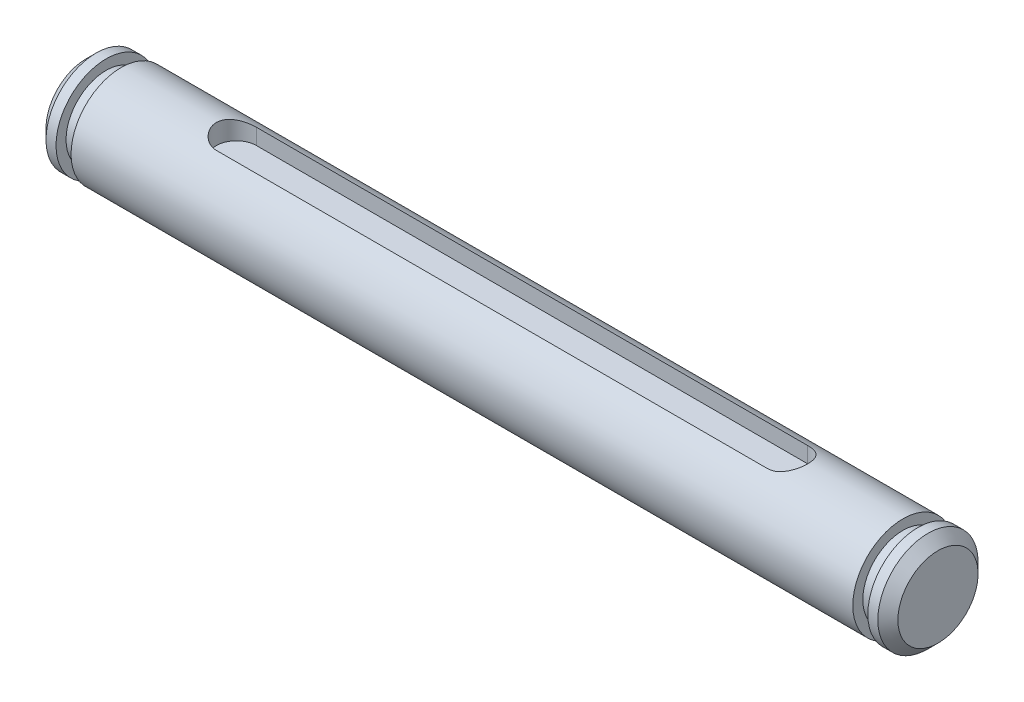
ISO-10303-21;
HEADER;
FILE_DESCRIPTION(('STEP AP214'),'2;1');
FILE_NAME('part.step','',(''),(''),'','','');
FILE_SCHEMA(('AUTOMOTIVE_DESIGN { 1 0 10303 214 1 1 1 1 }'));
ENDSEC;
DATA;
#1=APPLICATION_CONTEXT('core data for automotive mechanical design processes');
#2=APPLICATION_PROTOCOL_DEFINITION('international standard','automotive_design',2000,#1);
#3=PRODUCT_CONTEXT('',#1,'mechanical');
#4=PRODUCT('Part','Part','',(#3));
#5=PRODUCT_RELATED_PRODUCT_CATEGORY('part','',(#4));
#6=PRODUCT_DEFINITION_FORMATION('','',#4);
#7=PRODUCT_DEFINITION_CONTEXT('part definition',#1,'design');
#8=PRODUCT_DEFINITION('design','',#6,#7);
#9=PRODUCT_DEFINITION_SHAPE('','',#8);
#10=(LENGTH_UNIT() NAMED_UNIT(*) SI_UNIT(.MILLI.,.METRE.));
#11=(NAMED_UNIT(*) PLANE_ANGLE_UNIT() SI_UNIT($,.RADIAN.));
#12=(NAMED_UNIT(*) SI_UNIT($,.STERADIAN.) SOLID_ANGLE_UNIT());
#13=UNCERTAINTY_MEASURE_WITH_UNIT(LENGTH_MEASURE(1.E-05),#10,'distance_accuracy_value','');
#14=(GEOMETRIC_REPRESENTATION_CONTEXT(3) GLOBAL_UNCERTAINTY_ASSIGNED_CONTEXT((#13)) GLOBAL_UNIT_ASSIGNED_CONTEXT((#10,
#11,#12)) REPRESENTATION_CONTEXT('',''));
#15=CARTESIAN_POINT('',(0.,0.,0.));
#16=DIRECTION('',(0.,0.,1.));
#17=DIRECTION('',(1.,0.,0.));
#18=AXIS2_PLACEMENT_3D('',#15,#16,#17);
#19=CARTESIAN_POINT('',(-47.1519917646546,0.,0.));
#20=DIRECTION('',(-1.,0.,0.));
#21=DIRECTION('',(0.,0.,1.));
#22=AXIS2_PLACEMENT_3D('',#19,#20,#21);
#23=CYLINDRICAL_SURFACE('',#22,5.);
#24=CARTESIAN_POINT('',(39.,0.,0.));
#25=DIRECTION('',(-1.,0.,0.));
#26=DIRECTION('',(0.,0.,1.));
#27=AXIS2_PLACEMENT_3D('',#24,#25,#26);
#28=CIRCLE('',#27,5.00000000000001);
#29=CARTESIAN_POINT('',(39.,0.,5.00000000000001));
#30=VERTEX_POINT('',#29);
#31=EDGE_CURVE('E128',#30,#30,#28,.T.);
#32=ORIENTED_EDGE('',*,*,#31,.T.);
#33=EDGE_LOOP('',(#32));
#34=FACE_BOUND('',#33,.T.);
#35=CARTESIAN_POINT('',(-39.,0.,0.));
#36=DIRECTION('',(-1.,0.,0.));
#37=DIRECTION('',(0.,0.,1.));
#38=AXIS2_PLACEMENT_3D('',#35,#36,#37);
#39=CIRCLE('',#38,5.);
#40=CARTESIAN_POINT('',(-39.,0.,5.));
#41=VERTEX_POINT('',#40);
#42=EDGE_CURVE('E125',#41,#41,#39,.T.);
#43=ORIENTED_EDGE('',*,*,#42,.F.);
#44=EDGE_LOOP('',(#43));
#45=FACE_BOUND('',#44,.T.);
#46=CARTESIAN_POINT('',(-27.5,4.58257569495585,-2.));
#47=CARTESIAN_POINT('',(-27.5538058525026,4.58256464470382,-2.00000798036347));
#48=CARTESIAN_POINT('',(-27.6076056655576,4.58352306077323,-1.99782891366025));
#49=CARTESIAN_POINT('',(-27.7147712982547,4.58729625417544,-1.98915905973446));
#50=CARTESIAN_POINT('',(-27.768137275356,4.59011032448546,-1.98266991468792));
#51=CARTESIAN_POINT('',(-27.8738468215588,4.5974978292064,-1.9654760367637));
#52=CARTESIAN_POINT('',(-27.926193584044,4.60206430717533,-1.95478796820434));
#53=CARTESIAN_POINT('',(-28.0297007717145,4.61280053296683,-1.9293163019066));
#54=CARTESIAN_POINT('',(-28.0808611242772,4.61897037865399,-1.9145324541709));
#55=CARTESIAN_POINT('',(-28.231935850582,4.63959291248422,-1.86426971793523));
#56=CARTESIAN_POINT('',(-28.3296542306898,4.65617449157431,-1.82284489460008));
#57=CARTESIAN_POINT('',(-28.5167955800826,4.6931237076538,-1.72548191592176));
#58=CARTESIAN_POINT('',(-28.6062105529617,4.71349493864007,-1.66952996336925));
#59=CARTESIAN_POINT('',(-28.7792623966742,4.75700999402115,-1.54131835736855));
#60=CARTESIAN_POINT('',(-28.8623672169202,4.78024245635517,-1.4683691399273));
#61=CARTESIAN_POINT('',(-29.0155402722107,4.82612790548656,-1.30969646176209));
#62=CARTESIAN_POINT('',(-29.0856058308657,4.84878077249721,-1.22397038499682));
#63=CARTESIAN_POINT('',(-29.2134063941956,4.89203417106083,-1.03800590808969));
#64=CARTESIAN_POINT('',(-29.2705448092619,4.91251824543531,-0.937327933050964));
#65=CARTESIAN_POINT('',(-29.3668440726887,4.94803944125004,-0.726824143246711));
#66=CARTESIAN_POINT('',(-29.4060124240517,4.96307883544185,-0.617002169026244));
#67=CARTESIAN_POINT('',(-29.4633412013106,4.98538314653816,-0.396967441295689));
#68=CARTESIAN_POINT('',(-29.4824269509057,4.99298922547927,-0.287031054523057));
#69=CARTESIAN_POINT('',(-29.5020284799456,5.00080310201086,-0.0652684304565121));
#70=CARTESIAN_POINT('',(-29.5025508380235,5.0010135205303,0.0465571232841689));
#71=CARTESIAN_POINT('',(-29.4855171608401,4.99421960045303,0.262233376226788));
#72=CARTESIAN_POINT('',(-29.468974953326,4.98761985585461,0.366179202506795));
#73=CARTESIAN_POINT('',(-29.4200065729465,4.96849270441446,0.569674786500934));
#74=CARTESIAN_POINT('',(-29.3875795011314,4.9559649620993,0.669224295072847));
#75=CARTESIAN_POINT('',(-29.3073637035755,4.92596830598785,0.862897539070301));
#76=CARTESIAN_POINT('',(-29.2593507591896,4.90842774755848,0.956916851366445));
#77=CARTESIAN_POINT('',(-29.1495354114049,4.87014602008043,1.13580746919777));
#78=CARTESIAN_POINT('',(-29.0877281703094,4.84940372896449,1.22067554984698));
#79=CARTESIAN_POINT('',(-28.9473558197415,4.80521782746144,1.38476339273628));
#80=CARTESIAN_POINT('',(-28.86795752533,4.78168627172885,1.4632477030894));
#81=CARTESIAN_POINT('',(-28.6970199048523,4.7356195058465,1.60609926099479));
#82=CARTESIAN_POINT('',(-28.6054750779057,4.71308475332783,1.67046007709006));
#83=CARTESIAN_POINT('',(-28.4095297159788,4.67095688856025,1.78493657933606));
#84=CARTESIAN_POINT('',(-28.3048351633398,4.65146702150583,1.83458932217623));
#85=CARTESIAN_POINT('',(-28.0876384755705,4.61886105059582,1.91521298357265));
#86=CARTESIAN_POINT('',(-27.9751505526617,4.60573367628738,1.94621696002209));
#87=CARTESIAN_POINT('',(-27.801256365842,4.59208303529493,1.97810581825721));
#88=CARTESIAN_POINT('',(-27.7413424506987,4.58853437680526,1.9863050516598));
#89=CARTESIAN_POINT('',(-27.6209649810045,4.58377540314388,1.99725282103813));
#90=CARTESIAN_POINT('',(-27.5605017882422,4.58256364711744,2.00000471568569));
#91=CARTESIAN_POINT('',(-27.5,4.58257569495584,2.00000000000001));
#92=B_SPLINE_CURVE_WITH_KNOTS('',3,(#46,#47,#48,#49,#50,#51,#52,#53,#54,#55,#56,#57,#58,#59,#60,
#61,#62,#63,#64,#65,#66,#67,#68,#69,#70,#71,#72,#73,#74,#75,#76,#77,#78,#79,#80,#81,#82,#83,#84,
#85,#86,#87,#88,#89,#90,#91),.UNSPECIFIED.,.F.,.F.,(4,2,2,2,2,2,2,2,2,2,2,2,2,2,2,2,2,2,2,2,2,2,
4),(0.,0.161354853098824,0.322648263883212,0.483307911251883,0.643977367092306,
0.964683001739097,1.28569434942626,1.62318047995498,1.96073580539191,2.31162858925764,
2.66237473197323,2.9961387650427,3.32978451514656,3.64468915259536,3.95961161305655,
4.27928176927548,4.5990642113302,4.93981874675154,5.28072813203935,5.63144241548464,
5.98153315592126,6.16300192557815,6.34435877193562),.UNSPECIFIED.);
#93=CARTESIAN_POINT('',(-27.5,4.58257569495585,-2.));
#94=VERTEX_POINT('',#93);
#95=CARTESIAN_POINT('',(-27.5,4.58257569495585,2.00000000000001));
#96=VERTEX_POINT('',#95);
#97=EDGE_CURVE('E11',#94,#96,#92,.T.);
#98=ORIENTED_EDGE('',*,*,#97,.F.);
#99=DIRECTION('',(-1.,0.,0.));
#100=VECTOR('',#99,1.);
#101=CARTESIAN_POINT('',(-47.1519917646546,4.58257569495585,-2.));
#102=LINE('',#101,#100);
#103=CARTESIAN_POINT('',(27.5,4.58257569495584,-2.00000000000001));
#104=VERTEX_POINT('',#103);
#105=EDGE_CURVE('E61',#94,#104,#102,.F.);
#106=ORIENTED_EDGE('',*,*,#105,.T.);
#107=CARTESIAN_POINT('',(27.5,4.58257569495584,2.00000000000001));
#108=CARTESIAN_POINT('',(27.5538058525026,4.58256464470381,2.00000798036349));
#109=CARTESIAN_POINT('',(27.6076056655576,4.58352306077323,1.99782891366026));
#110=CARTESIAN_POINT('',(27.7147712982547,4.58729625417543,1.98915905973448));
#111=CARTESIAN_POINT('',(27.768137275356,4.59011032448545,1.98266991468794));
#112=CARTESIAN_POINT('',(27.8738468215588,4.59749782920639,1.96547603676371));
#113=CARTESIAN_POINT('',(27.926193584044,4.60206430717533,1.95478796820435));
#114=CARTESIAN_POINT('',(28.0297007717145,4.61280053296682,1.92931630190662));
#115=CARTESIAN_POINT('',(28.0808611242772,4.61897037865398,1.91453245417092));
#116=CARTESIAN_POINT('',(28.231935850582,4.63959291248421,1.86426971793524));
#117=CARTESIAN_POINT('',(28.3296542306898,4.6561744915743,1.82284489460009));
#118=CARTESIAN_POINT('',(28.5167955800826,4.6931237076538,1.72548191592177));
#119=CARTESIAN_POINT('',(28.6062105529617,4.71349493864007,1.66952996336927));
#120=CARTESIAN_POINT('',(28.7792623966742,4.75700999402114,1.54131835736856));
#121=CARTESIAN_POINT('',(28.8623672169202,4.78024245635516,1.46836913992731));
#122=CARTESIAN_POINT('',(29.0155402722107,4.82612790548656,1.3096964617621));
#123=CARTESIAN_POINT('',(29.0856058308657,4.84878077249721,1.22397038499683));
#124=CARTESIAN_POINT('',(29.2134063941957,4.89203417106082,1.0380059080897));
#125=CARTESIAN_POINT('',(29.2705448092619,4.91251824543531,0.937327933050974));
#126=CARTESIAN_POINT('',(29.3668440726887,4.94803944125004,0.72682414324672));
#127=CARTESIAN_POINT('',(29.4060124240517,4.96307883544185,0.617002169026255));
#128=CARTESIAN_POINT('',(29.4633412013106,4.98538314653816,0.396967441295701));
#129=CARTESIAN_POINT('',(29.4824269509057,4.99298922547927,0.287031054523069));
#130=CARTESIAN_POINT('',(29.5020284799456,5.00080310201086,0.0652684304565236));
#131=CARTESIAN_POINT('',(29.5025508380235,5.0010135205303,-0.0465571232841574));
#132=CARTESIAN_POINT('',(29.4855171608401,4.99421960045303,-0.262233376226777));
#133=CARTESIAN_POINT('',(29.468974953326,4.98761985585461,-0.366179202506784));
#134=CARTESIAN_POINT('',(29.4200065729465,4.96849270441447,-0.569674786500923));
#135=CARTESIAN_POINT('',(29.3875795011314,4.9559649620993,-0.669224295072836));
#136=CARTESIAN_POINT('',(29.3073637035755,4.92596830598786,-0.86289753907029));
#137=CARTESIAN_POINT('',(29.2593507591896,4.90842774755848,-0.956916851366434));
#138=CARTESIAN_POINT('',(29.1495354114049,4.87014602008044,-1.13580746919776));
#139=CARTESIAN_POINT('',(29.0877281703094,4.84940372896449,-1.22067554984697));
#140=CARTESIAN_POINT('',(28.9473558197415,4.80521782746144,-1.38476339273626));
#141=CARTESIAN_POINT('',(28.86795752533,4.78168627172885,-1.46324770308939));
#142=CARTESIAN_POINT('',(28.6970199048523,4.7356195058465,-1.60609926099477));
#143=CARTESIAN_POINT('',(28.6054750779057,4.71308475332783,-1.67046007709005));
#144=CARTESIAN_POINT('',(28.4095297159788,4.67095688856025,-1.78493657933605));
#145=CARTESIAN_POINT('',(28.3048351633398,4.65146702150584,-1.83458932217622));
#146=CARTESIAN_POINT('',(28.0876384755705,4.61886105059582,-1.91521298357264));
#147=CARTESIAN_POINT('',(27.9751505526617,4.60573367628738,-1.94621696002208));
#148=CARTESIAN_POINT('',(27.801256365842,4.59208303529493,-1.9781058182572));
#149=CARTESIAN_POINT('',(27.7413424506987,4.58853437680527,-1.98630505165979));
#150=CARTESIAN_POINT('',(27.6209649810045,4.58377540314389,-1.99725282103812));
#151=CARTESIAN_POINT('',(27.5605017882422,4.58256364711745,-2.00000471568568));
#152=CARTESIAN_POINT('',(27.5,4.58257569495585,-2.));
#153=B_SPLINE_CURVE_WITH_KNOTS('',3,(#107,#108,#109,#110,#111,#112,#113,#114,#115,#116,#117,
#118,#119,#120,#121,#122,#123,#124,#125,#126,#127,#128,#129,#130,#131,#132,#133,#134,#135,#136,
#137,#138,#139,#140,#141,#142,#143,#144,#145,#146,#147,#148,#149,#150,#151,#152),.UNSPECIFIED.,
.F.,.F.,(4,2,2,2,2,2,2,2,2,2,2,2,2,2,2,2,2,2,2,2,2,2,4),(0.,0.161354853098825,0.322648263883212,
0.483307911251883,0.643977367092306,0.964683001739097,1.28569434942626,1.62318047995498,
1.96073580539191,2.31162858925764,2.66237473197323,2.99613876504271,3.32978451514656,
3.64468915259536,3.95961161305655,4.27928176927548,4.5990642113302,4.93981874675154,
5.28072813203935,5.63144241548464,5.98153315592126,6.16300192557815,6.34435877193563),.UNSPECIFIED.);
#154=CARTESIAN_POINT('',(27.5,4.58257569495585,2.00000000000001));
#155=VERTEX_POINT('',#154);
#156=EDGE_CURVE('E54',#155,#104,#153,.T.);
#157=ORIENTED_EDGE('',*,*,#156,.F.);
#158=DIRECTION('',(-1.,0.,0.));
#159=VECTOR('',#158,1.);
#160=CARTESIAN_POINT('',(-47.1519917646546,4.58257569495584,2.));
#161=LINE('',#160,#159);
#162=EDGE_CURVE('E152',#155,#96,#161,.T.);
#163=ORIENTED_EDGE('',*,*,#162,.T.);
#164=EDGE_LOOP('',(#98,#106,#157,#163));
#165=FACE_BOUND('',#164,.T.);
#166=ADVANCED_FACE('F41',(#34,#45,#165),#23,.T.);
#167=CARTESIAN_POINT('',(42.5,0.,0.));
#168=DIRECTION('',(-1.,0.,0.));
#169=DIRECTION('',(0.,0.,1.));
#170=AXIS2_PLACEMENT_3D('',#167,#168,#169);
#171=PLANE('',#170);
#172=CARTESIAN_POINT('',(42.5,0.,0.));
#173=DIRECTION('',(-1.,0.,0.));
#174=DIRECTION('',(0.,0.,1.));
#175=AXIS2_PLACEMENT_3D('',#172,#173,#174);
#176=CIRCLE('',#175,4.);
#177=CARTESIAN_POINT('',(42.5,0.,4.));
#178=VERTEX_POINT('',#177);
#179=EDGE_CURVE('E143',#178,#178,#176,.F.);
#180=ORIENTED_EDGE('',*,*,#179,.T.);
#181=EDGE_LOOP('',(#180));
#182=FACE_BOUND('',#181,.T.);
#183=ADVANCED_FACE('F204',(#182),#171,.F.);
#184=CARTESIAN_POINT('',(-47.1519917646546,0.,0.));
#185=DIRECTION('',(-1.,0.,0.));
#186=DIRECTION('',(0.,0.,1.));
#187=AXIS2_PLACEMENT_3D('',#184,#185,#186);
#188=CYLINDRICAL_SURFACE('',#187,5.00000000000001);
#189=CARTESIAN_POINT('',(41.5,0.,0.));
#190=DIRECTION('',(-1.,0.,0.));
#191=DIRECTION('',(0.,0.,1.));
#192=AXIS2_PLACEMENT_3D('',#189,#190,#191);
#193=CIRCLE('',#192,5.00000000000001);
#194=CARTESIAN_POINT('',(41.5,0.,5.00000000000001));
#195=VERTEX_POINT('',#194);
#196=EDGE_CURVE('E140',#195,#195,#193,.T.);
#197=ORIENTED_EDGE('',*,*,#196,.T.);
#198=EDGE_LOOP('',(#197));
#199=FACE_BOUND('',#198,.T.);
#200=CARTESIAN_POINT('',(40.5,0.,0.));
#201=DIRECTION('',(-1.,0.,0.));
#202=DIRECTION('',(0.,0.,1.));
#203=AXIS2_PLACEMENT_3D('',#200,#201,#202);
#204=CIRCLE('',#203,5.00000000000001);
#205=CARTESIAN_POINT('',(40.5,0.,5.00000000000001));
#206=VERTEX_POINT('',#205);
#207=EDGE_CURVE('E137',#206,#206,#204,.T.);
#208=ORIENTED_EDGE('',*,*,#207,.F.);
#209=EDGE_LOOP('',(#208));
#210=FACE_BOUND('',#209,.T.);
#211=ADVANCED_FACE('F209',(#199,#210),#188,.T.);
#212=CARTESIAN_POINT('',(40.5,5.00000000000001,0.));
#213=DIRECTION('',(1.,0.,0.));
#214=DIRECTION('',(0.,0.,-1.));
#215=AXIS2_PLACEMENT_3D('',#212,#213,#214);
#216=PLANE('',#215);
#217=CARTESIAN_POINT('',(40.5,0.,0.));
#218=DIRECTION('',(-1.,0.,0.));
#219=DIRECTION('',(0.,0.,1.));
#220=AXIS2_PLACEMENT_3D('',#217,#218,#219);
#221=CIRCLE('',#220,4.00000000000001);
#222=CARTESIAN_POINT('',(40.5,0.,4.00000000000001));
#223=VERTEX_POINT('',#222);
#224=EDGE_CURVE('E134',#223,#223,#221,.T.);
#225=ORIENTED_EDGE('',*,*,#224,.F.);
#226=EDGE_LOOP('',(#225));
#227=FACE_BOUND('',#226,.T.);
#228=ORIENTED_EDGE('',*,*,#207,.T.);
#229=EDGE_LOOP('',(#228));
#230=FACE_BOUND('',#229,.T.);
#231=ADVANCED_FACE('F285',(#227,#230),#216,.F.);
#232=CARTESIAN_POINT('',(-47.1519917646546,0.,0.));
#233=DIRECTION('',(-1.,0.,0.));
#234=DIRECTION('',(0.,0.,1.));
#235=AXIS2_PLACEMENT_3D('',#232,#233,#234);
#236=CYLINDRICAL_SURFACE('',#235,4.00000000000001);
#237=CARTESIAN_POINT('',(39.,0.,0.));
#238=DIRECTION('',(-1.,0.,0.));
#239=DIRECTION('',(0.,0.,1.));
#240=AXIS2_PLACEMENT_3D('',#237,#238,#239);
#241=CIRCLE('',#240,4.00000000000001);
#242=CARTESIAN_POINT('',(39.,0.,4.00000000000001));
#243=VERTEX_POINT('',#242);
#244=EDGE_CURVE('E131',#243,#243,#241,.T.);
#245=ORIENTED_EDGE('',*,*,#244,.F.);
#246=EDGE_LOOP('',(#245));
#247=FACE_BOUND('',#246,.T.);
#248=ORIENTED_EDGE('',*,*,#224,.T.);
#249=EDGE_LOOP('',(#248));
#250=FACE_BOUND('',#249,.T.);
#251=ADVANCED_FACE('F199',(#247,#250),#236,.T.);
#252=CARTESIAN_POINT('',(39.,4.00000000000001,0.));
#253=DIRECTION('',(-1.,0.,0.));
#254=DIRECTION('',(0.,0.,1.));
#255=AXIS2_PLACEMENT_3D('',#252,#253,#254);
#256=PLANE('',#255);
#257=ORIENTED_EDGE('',*,*,#31,.F.);
#258=EDGE_LOOP('',(#257));
#259=FACE_BOUND('',#258,.T.);
#260=ORIENTED_EDGE('',*,*,#244,.T.);
#261=EDGE_LOOP('',(#260));
#262=FACE_BOUND('',#261,.T.);
#263=ADVANCED_FACE('F194',(#259,#262),#256,.F.);
#264=CARTESIAN_POINT('',(-39.,4.,0.));
#265=DIRECTION('',(1.,0.,0.));
#266=DIRECTION('',(0.,0.,-1.));
#267=AXIS2_PLACEMENT_3D('',#264,#265,#266);
#268=PLANE('',#267);
#269=CARTESIAN_POINT('',(-39.,0.,0.));
#270=DIRECTION('',(-1.,0.,0.));
#271=DIRECTION('',(0.,0.,1.));
#272=AXIS2_PLACEMENT_3D('',#269,#270,#271);
#273=CIRCLE('',#272,4.);
#274=CARTESIAN_POINT('',(-39.,0.,4.));
#275=VERTEX_POINT('',#274);
#276=EDGE_CURVE('E122',#275,#275,#273,.T.);
#277=ORIENTED_EDGE('',*,*,#276,.F.);
#278=EDGE_LOOP('',(#277));
#279=FACE_BOUND('',#278,.T.);
#280=ORIENTED_EDGE('',*,*,#42,.T.);
#281=EDGE_LOOP('',(#280));
#282=FACE_BOUND('',#281,.T.);
#283=ADVANCED_FACE('F191',(#279,#282),#268,.F.);
#284=CARTESIAN_POINT('',(-47.1519917646546,0.,0.));
#285=DIRECTION('',(-1.,0.,0.));
#286=DIRECTION('',(0.,0.,1.));
#287=AXIS2_PLACEMENT_3D('',#284,#285,#286);
#288=CYLINDRICAL_SURFACE('',#287,4.);
#289=CARTESIAN_POINT('',(-40.5,0.,0.));
#290=DIRECTION('',(-1.,0.,0.));
#291=DIRECTION('',(0.,0.,1.));
#292=AXIS2_PLACEMENT_3D('',#289,#290,#291);
#293=CIRCLE('',#292,4.);
#294=CARTESIAN_POINT('',(-40.5,0.,4.));
#295=VERTEX_POINT('',#294);
#296=EDGE_CURVE('E119',#295,#295,#293,.T.);
#297=ORIENTED_EDGE('',*,*,#296,.F.);
#298=EDGE_LOOP('',(#297));
#299=FACE_BOUND('',#298,.T.);
#300=ORIENTED_EDGE('',*,*,#276,.T.);
#301=EDGE_LOOP('',(#300));
#302=FACE_BOUND('',#301,.T.);
#303=ADVANCED_FACE('F188',(#299,#302),#288,.T.);
#304=CARTESIAN_POINT('',(-40.5,5.,0.));
#305=DIRECTION('',(-1.,0.,0.));
#306=DIRECTION('',(0.,0.,1.));
#307=AXIS2_PLACEMENT_3D('',#304,#305,#306);
#308=PLANE('',#307);
#309=CARTESIAN_POINT('',(-40.5,0.,0.));
#310=DIRECTION('',(-1.,0.,0.));
#311=DIRECTION('',(0.,0.,1.));
#312=AXIS2_PLACEMENT_3D('',#309,#310,#311);
#313=CIRCLE('',#312,5.);
#314=CARTESIAN_POINT('',(-40.5,0.,5.));
#315=VERTEX_POINT('',#314);
#316=EDGE_CURVE('E95',#315,#315,#313,.T.);
#317=ORIENTED_EDGE('',*,*,#316,.F.);
#318=EDGE_LOOP('',(#317));
#319=FACE_BOUND('',#318,.T.);
#320=ORIENTED_EDGE('',*,*,#296,.T.);
#321=EDGE_LOOP('',(#320));
#322=FACE_BOUND('',#321,.T.);
#323=ADVANCED_FACE('F184',(#319,#322),#308,.F.);
#324=CARTESIAN_POINT('',(-47.1519917646546,0.,0.));
#325=DIRECTION('',(-1.,0.,0.));
#326=DIRECTION('',(0.,0.,1.));
#327=AXIS2_PLACEMENT_3D('',#324,#325,#326);
#328=CYLINDRICAL_SURFACE('',#327,5.);
#329=CARTESIAN_POINT('',(-41.5,0.,0.));
#330=DIRECTION('',(1.,0.,0.));
#331=DIRECTION('',(0.,0.,-1.));
#332=AXIS2_PLACEMENT_3D('',#329,#330,#331);
#333=CIRCLE('',#332,5.);
#334=CARTESIAN_POINT('',(-41.5,0.,-5.));
#335=VERTEX_POINT('',#334);
#336=EDGE_CURVE('E149',#335,#335,#333,.T.);
#337=ORIENTED_EDGE('',*,*,#336,.T.);
#338=EDGE_LOOP('',(#337));
#339=FACE_BOUND('',#338,.T.);
#340=ORIENTED_EDGE('',*,*,#316,.T.);
#341=EDGE_LOOP('',(#340));
#342=FACE_BOUND('',#341,.T.);
#343=ADVANCED_FACE('F180',(#339,#342),#328,.T.);
#344=CARTESIAN_POINT('',(-42.5,0.,0.));
#345=DIRECTION('',(1.,0.,0.));
#346=DIRECTION('',(0.,0.,-1.));
#347=AXIS2_PLACEMENT_3D('',#344,#345,#346);
#348=PLANE('',#347);
#349=CARTESIAN_POINT('',(-42.5,0.,0.));
#350=DIRECTION('',(1.,0.,0.));
#351=DIRECTION('',(0.,0.,-1.));
#352=AXIS2_PLACEMENT_3D('',#349,#350,#351);
#353=CIRCLE('',#352,4.);
#354=CARTESIAN_POINT('',(-42.5,0.,-4.));
#355=VERTEX_POINT('',#354);
#356=EDGE_CURVE('E146',#355,#355,#353,.F.);
#357=ORIENTED_EDGE('',*,*,#356,.T.);
#358=EDGE_LOOP('',(#357));
#359=FACE_BOUND('',#358,.T.);
#360=ADVANCED_FACE('F176',(#359),#348,.F.);
#361=CARTESIAN_POINT('',(41.5,0.,0.));
#362=DIRECTION('',(-1.,0.,0.));
#363=DIRECTION('',(0.,0.,1.));
#364=AXIS2_PLACEMENT_3D('',#361,#362,#363);
#365=CONICAL_SURFACE('',#364,5.00000000000001,0.785398163397458);
#366=ORIENTED_EDGE('',*,*,#179,.F.);
#367=EDGE_LOOP('',(#366));
#368=FACE_BOUND('',#367,.T.);
#369=ORIENTED_EDGE('',*,*,#196,.F.);
#370=EDGE_LOOP('',(#369));
#371=FACE_BOUND('',#370,.T.);
#372=ADVANCED_FACE('F179',(#368,#371),#365,.T.);
#373=CARTESIAN_POINT('',(-42.5,0.,0.));
#374=DIRECTION('',(1.,0.,0.));
#375=DIRECTION('',(0.,0.,-1.));
#376=AXIS2_PLACEMENT_3D('',#373,#374,#375);
#377=CONICAL_SURFACE('',#376,4.,0.785398163397443);
#378=ORIENTED_EDGE('',*,*,#336,.F.);
#379=EDGE_LOOP('',(#378));
#380=FACE_BOUND('',#379,.T.);
#381=ORIENTED_EDGE('',*,*,#356,.F.);
#382=EDGE_LOOP('',(#381));
#383=FACE_BOUND('',#382,.T.);
#384=ADVANCED_FACE('F43',(#380,#383),#377,.T.);
#385=CARTESIAN_POINT('',(-5.,7.,-2.));
#386=DIRECTION('',(0.,0.,-1.));
#387=DIRECTION('',(0.,1.,0.));
#388=AXIS2_PLACEMENT_3D('',#385,#386,#387);
#389=PLANE('',#388);
#390=ORIENTED_EDGE('',*,*,#105,.F.);
#391=DIRECTION('',(0.,-1.,0.));
#392=VECTOR('',#391,1.);
#393=CARTESIAN_POINT('',(-27.5,13.,-2.));
#394=LINE('',#393,#392);
#395=CARTESIAN_POINT('',(-27.5,3.,-2.));
#396=VERTEX_POINT('',#395);
#397=EDGE_CURVE('E89',#94,#396,#394,.T.);
#398=ORIENTED_EDGE('',*,*,#397,.T.);
#399=DIRECTION('',(1.,0.,0.));
#400=VECTOR('',#399,1.);
#401=CARTESIAN_POINT('',(-5.,3.,-2.));
#402=LINE('',#401,#400);
#403=CARTESIAN_POINT('',(27.5,3.,-2.00000000000001));
#404=VERTEX_POINT('',#403);
#405=EDGE_CURVE('E85',#396,#404,#402,.T.);
#406=ORIENTED_EDGE('',*,*,#405,.T.);
#407=DIRECTION('',(0.,-1.,0.));
#408=VECTOR('',#407,1.);
#409=CARTESIAN_POINT('',(27.5,13.,-2.00000000000001));
#410=LINE('',#409,#408);
#411=EDGE_CURVE('E88',#104,#404,#410,.T.);
#412=ORIENTED_EDGE('',*,*,#411,.F.);
#413=EDGE_LOOP('',(#390,#398,#406,#412));
#414=FACE_BOUND('',#413,.T.);
#415=ADVANCED_FACE('F87',(#414),#389,.F.);
#416=CARTESIAN_POINT('',(-5.,7.,2.));
#417=DIRECTION('',(0.,0.,1.));
#418=DIRECTION('',(0.,-1.,0.));
#419=AXIS2_PLACEMENT_3D('',#416,#417,#418);
#420=PLANE('',#419);
#421=ORIENTED_EDGE('',*,*,#162,.F.);
#422=DIRECTION('',(0.,-1.,0.));
#423=VECTOR('',#422,1.);
#424=CARTESIAN_POINT('',(27.5,13.,2.));
#425=LINE('',#424,#423);
#426=CARTESIAN_POINT('',(27.5,3.,2.00000000000001));
#427=VERTEX_POINT('',#426);
#428=EDGE_CURVE('E108',#155,#427,#425,.T.);
#429=ORIENTED_EDGE('',*,*,#428,.T.);
#430=DIRECTION('',(1.,0.,0.));
#431=VECTOR('',#430,1.);
#432=CARTESIAN_POINT('',(-5.,3.,2.));
#433=LINE('',#432,#431);
#434=CARTESIAN_POINT('',(-27.5,3.,2.00000000000001));
#435=VERTEX_POINT('',#434);
#436=EDGE_CURVE('E96',#435,#427,#433,.T.);
#437=ORIENTED_EDGE('',*,*,#436,.F.);
#438=DIRECTION('',(0.,-1.,0.));
#439=VECTOR('',#438,1.);
#440=CARTESIAN_POINT('',(-27.5,13.,2.));
#441=LINE('',#440,#439);
#442=EDGE_CURVE('E112',#96,#435,#441,.T.);
#443=ORIENTED_EDGE('',*,*,#442,.F.);
#444=EDGE_LOOP('',(#421,#429,#437,#443));
#445=FACE_BOUND('',#444,.T.);
#446=ADVANCED_FACE('F170',(#445),#420,.F.);
#447=CARTESIAN_POINT('',(-5.,3.,-2.));
#448=DIRECTION('',(0.,-1.,0.));
#449=DIRECTION('',(0.,0.,-1.));
#450=AXIS2_PLACEMENT_3D('',#447,#448,#449);
#451=PLANE('',#450);
#452=ORIENTED_EDGE('',*,*,#436,.T.);
#453=CARTESIAN_POINT('',(27.5,3.,0.));
#454=DIRECTION('',(0.,1.,0.));
#455=DIRECTION('',(0.,0.,1.));
#456=AXIS2_PLACEMENT_3D('',#453,#454,#455);
#457=CIRCLE('',#456,2.00000000000001);
#458=EDGE_CURVE('E102',#427,#404,#457,.T.);
#459=ORIENTED_EDGE('',*,*,#458,.T.);
#460=ORIENTED_EDGE('',*,*,#405,.F.);
#461=CARTESIAN_POINT('',(-27.5,3.,0.));
#462=DIRECTION('',(0.,1.,0.));
#463=DIRECTION('',(0.,0.,1.));
#464=AXIS2_PLACEMENT_3D('',#461,#462,#463);
#465=CIRCLE('',#464,2.00000000000001);
#466=EDGE_CURVE('E106',#396,#435,#465,.T.);
#467=ORIENTED_EDGE('',*,*,#466,.T.);
#468=EDGE_LOOP('',(#452,#459,#460,#467));
#469=FACE_BOUND('',#468,.T.);
#470=ADVANCED_FACE('F104',(#469),#451,.F.);
#471=CARTESIAN_POINT('',(27.5,13.,0.));
#472=DIRECTION('',(0.,-1.,0.));
#473=DIRECTION('',(0.,0.,-1.));
#474=AXIS2_PLACEMENT_3D('',#471,#472,#473);
#475=CYLINDRICAL_SURFACE('',#474,2.00000000000001);
#476=ORIENTED_EDGE('',*,*,#156,.T.);
#477=ORIENTED_EDGE('',*,*,#411,.T.);
#478=ORIENTED_EDGE('',*,*,#458,.F.);
#479=ORIENTED_EDGE('',*,*,#428,.F.);
#480=EDGE_LOOP('',(#476,#477,#478,#479));
#481=FACE_BOUND('',#480,.T.);
#482=ADVANCED_FACE('F100',(#481),#475,.F.);
#483=CARTESIAN_POINT('',(-27.5,13.,0.));
#484=DIRECTION('',(0.,-1.,0.));
#485=DIRECTION('',(0.,0.,-1.));
#486=AXIS2_PLACEMENT_3D('',#483,#484,#485);
#487=CYLINDRICAL_SURFACE('',#486,2.00000000000001);
#488=ORIENTED_EDGE('',*,*,#97,.T.);
#489=ORIENTED_EDGE('',*,*,#442,.T.);
#490=ORIENTED_EDGE('',*,*,#466,.F.);
#491=ORIENTED_EDGE('',*,*,#397,.F.);
#492=EDGE_LOOP('',(#488,#489,#490,#491));
#493=FACE_BOUND('',#492,.T.);
#494=ADVANCED_FACE('F166',(#493),#487,.F.);
#495=CLOSED_SHELL('',(#166,#183,#211,#231,#251,#263,#283,#303,#323,#343,#360,#372,#384,#415,
#446,#470,#482,#494));
#496=MANIFOLD_SOLID_BREP('B2',#495);
#497=ADVANCED_BREP_SHAPE_REPRESENTATION('',(#18,#496),#14);
#498=SHAPE_DEFINITION_REPRESENTATION(#9,#497);
ENDSEC;
END-ISO-10303-21;
